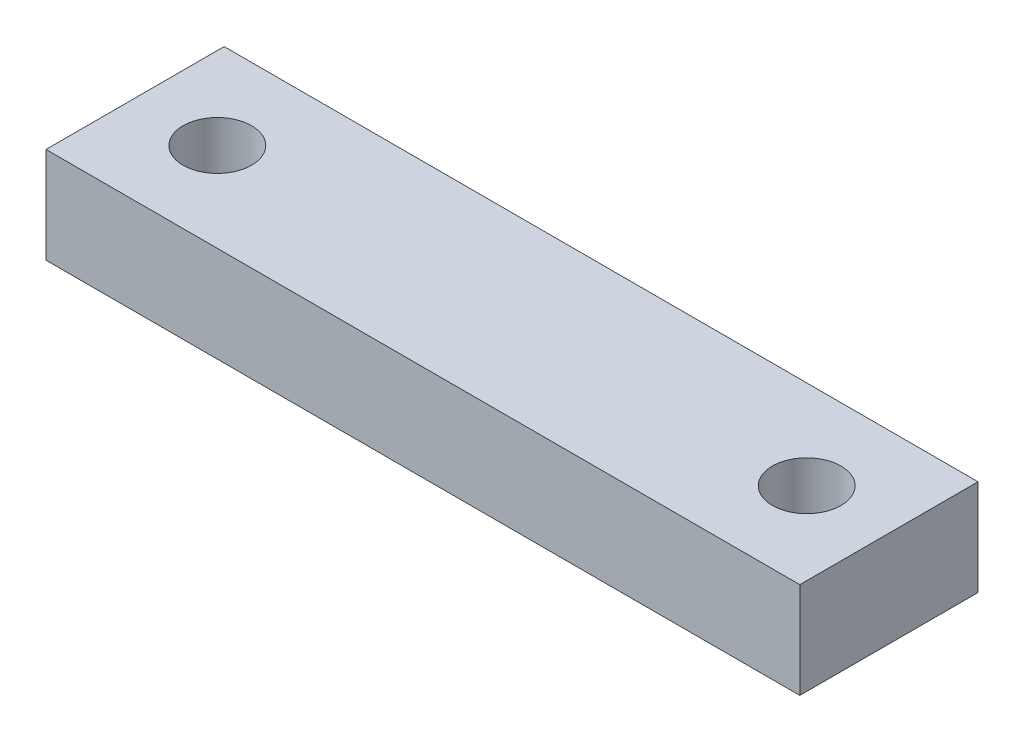
ISO-10303-21;
HEADER;
FILE_DESCRIPTION(('STEP AP214'),'2;1');
FILE_NAME('part.step','',(''),(''),'','','');
FILE_SCHEMA(('AUTOMOTIVE_DESIGN { 1 0 10303 214 1 1 1 1 }'));
ENDSEC;
DATA;
#1=APPLICATION_CONTEXT('core data for automotive mechanical design processes');
#2=APPLICATION_PROTOCOL_DEFINITION('international standard','automotive_design',2000,#1);
#3=PRODUCT_CONTEXT('',#1,'mechanical');
#4=PRODUCT('Part','Part','',(#3));
#5=PRODUCT_RELATED_PRODUCT_CATEGORY('part','',(#4));
#6=PRODUCT_DEFINITION_FORMATION('','',#4);
#7=PRODUCT_DEFINITION_CONTEXT('part definition',#1,'design');
#8=PRODUCT_DEFINITION('design','',#6,#7);
#9=PRODUCT_DEFINITION_SHAPE('','',#8);
#10=(LENGTH_UNIT() NAMED_UNIT(*) SI_UNIT(.MILLI.,.METRE.));
#11=(NAMED_UNIT(*) PLANE_ANGLE_UNIT() SI_UNIT($,.RADIAN.));
#12=(NAMED_UNIT(*) SI_UNIT($,.STERADIAN.) SOLID_ANGLE_UNIT());
#13=UNCERTAINTY_MEASURE_WITH_UNIT(LENGTH_MEASURE(1.E-05),#10,'distance_accuracy_value','');
#14=(GEOMETRIC_REPRESENTATION_CONTEXT(3) GLOBAL_UNCERTAINTY_ASSIGNED_CONTEXT((#13)) GLOBAL_UNIT_ASSIGNED_CONTEXT((#10,
#11,#12)) REPRESENTATION_CONTEXT('',''));
#15=CARTESIAN_POINT('',(0.,0.,0.));
#16=DIRECTION('',(0.,0.,1.));
#17=DIRECTION('',(1.,0.,0.));
#18=AXIS2_PLACEMENT_3D('',#15,#16,#17);
#19=CARTESIAN_POINT('',(27.5,7.,-6.5));
#20=DIRECTION('',(-1.,0.,0.));
#21=DIRECTION('',(0.,0.,1.));
#22=AXIS2_PLACEMENT_3D('',#19,#20,#21);
#23=PLANE('',#22);
#24=DIRECTION('',(0.,0.,-1.));
#25=VECTOR('',#24,1.);
#26=CARTESIAN_POINT('',(27.5,0.,-6.5));
#27=LINE('',#26,#25);
#28=CARTESIAN_POINT('',(27.5,0.,6.5));
#29=VERTEX_POINT('',#28);
#30=CARTESIAN_POINT('',(27.5,0.,-6.5));
#31=VERTEX_POINT('',#30);
#32=EDGE_CURVE('E107',#29,#31,#27,.T.);
#33=ORIENTED_EDGE('',*,*,#32,.T.);
#34=DIRECTION('',(0.,-1.,0.));
#35=VECTOR('',#34,1.);
#36=CARTESIAN_POINT('',(27.5,7.,-6.5));
#37=LINE('',#36,#35);
#38=CARTESIAN_POINT('',(27.5,7.,-6.5));
#39=VERTEX_POINT('',#38);
#40=EDGE_CURVE('E11',#39,#31,#37,.T.);
#41=ORIENTED_EDGE('',*,*,#40,.F.);
#42=DIRECTION('',(0.,0.,-1.));
#43=VECTOR('',#42,1.);
#44=CARTESIAN_POINT('',(27.5,7.,-6.5));
#45=LINE('',#44,#43);
#46=CARTESIAN_POINT('',(27.5,7.,6.5));
#47=VERTEX_POINT('',#46);
#48=EDGE_CURVE('E91',#47,#39,#45,.T.);
#49=ORIENTED_EDGE('',*,*,#48,.F.);
#50=DIRECTION('',(0.,-1.,0.));
#51=VECTOR('',#50,1.);
#52=CARTESIAN_POINT('',(27.5,7.,6.5));
#53=LINE('',#52,#51);
#54=EDGE_CURVE('E103',#47,#29,#53,.T.);
#55=ORIENTED_EDGE('',*,*,#54,.T.);
#56=EDGE_LOOP('',(#33,#41,#49,#55));
#57=FACE_BOUND('',#56,.T.);
#58=ADVANCED_FACE('F39',(#57),#23,.F.);
#59=CARTESIAN_POINT('',(-27.5,7.,-6.5));
#60=DIRECTION('',(0.,0.,1.));
#61=DIRECTION('',(1.,0.,0.));
#62=AXIS2_PLACEMENT_3D('',#59,#60,#61);
#63=PLANE('',#62);
#64=DIRECTION('',(-1.,0.,0.));
#65=VECTOR('',#64,1.);
#66=CARTESIAN_POINT('',(-27.5,0.,-6.5));
#67=LINE('',#66,#65);
#68=CARTESIAN_POINT('',(-27.5,0.,-6.5));
#69=VERTEX_POINT('',#68);
#70=EDGE_CURVE('E96',#31,#69,#67,.T.);
#71=ORIENTED_EDGE('',*,*,#70,.T.);
#72=DIRECTION('',(0.,-1.,0.));
#73=VECTOR('',#72,1.);
#74=CARTESIAN_POINT('',(-27.5,7.,-6.5));
#75=LINE('',#74,#73);
#76=CARTESIAN_POINT('',(-27.5,7.,-6.5));
#77=VERTEX_POINT('',#76);
#78=EDGE_CURVE('E48',#77,#69,#75,.T.);
#79=ORIENTED_EDGE('',*,*,#78,.F.);
#80=DIRECTION('',(-1.,0.,0.));
#81=VECTOR('',#80,1.);
#82=CARTESIAN_POINT('',(-27.5,7.,-6.5));
#83=LINE('',#82,#81);
#84=EDGE_CURVE('E86',#39,#77,#83,.T.);
#85=ORIENTED_EDGE('',*,*,#84,.F.);
#86=ORIENTED_EDGE('',*,*,#40,.T.);
#87=EDGE_LOOP('',(#71,#79,#85,#86));
#88=FACE_BOUND('',#87,.T.);
#89=ADVANCED_FACE('F95',(#88),#63,.F.);
#90=CARTESIAN_POINT('',(-27.5,7.,-6.5));
#91=DIRECTION('',(1.,0.,0.));
#92=DIRECTION('',(0.,0.,-1.));
#93=AXIS2_PLACEMENT_3D('',#90,#91,#92);
#94=PLANE('',#93);
#95=DIRECTION('',(0.,0.,1.));
#96=VECTOR('',#95,1.);
#97=CARTESIAN_POINT('',(-27.5,0.,-6.5));
#98=LINE('',#97,#96);
#99=CARTESIAN_POINT('',(-27.5,0.,6.5));
#100=VERTEX_POINT('',#99);
#101=EDGE_CURVE('E73',#69,#100,#98,.T.);
#102=ORIENTED_EDGE('',*,*,#101,.T.);
#103=DIRECTION('',(0.,-1.,0.));
#104=VECTOR('',#103,1.);
#105=CARTESIAN_POINT('',(-27.5,7.,6.5));
#106=LINE('',#105,#104);
#107=CARTESIAN_POINT('',(-27.5,7.,6.5));
#108=VERTEX_POINT('',#107);
#109=EDGE_CURVE('E98',#108,#100,#106,.T.);
#110=ORIENTED_EDGE('',*,*,#109,.F.);
#111=DIRECTION('',(0.,0.,1.));
#112=VECTOR('',#111,1.);
#113=CARTESIAN_POINT('',(-27.5,7.,-6.5));
#114=LINE('',#113,#112);
#115=EDGE_CURVE('E89',#77,#108,#114,.T.);
#116=ORIENTED_EDGE('',*,*,#115,.F.);
#117=ORIENTED_EDGE('',*,*,#78,.T.);
#118=EDGE_LOOP('',(#102,#110,#116,#117));
#119=FACE_BOUND('',#118,.T.);
#120=ADVANCED_FACE('F99',(#119),#94,.F.);
#121=CARTESIAN_POINT('',(-27.5,7.,6.5));
#122=DIRECTION('',(0.,0.,-1.));
#123=DIRECTION('',(-1.,0.,0.));
#124=AXIS2_PLACEMENT_3D('',#121,#122,#123);
#125=PLANE('',#124);
#126=DIRECTION('',(1.,0.,0.));
#127=VECTOR('',#126,1.);
#128=CARTESIAN_POINT('',(-27.5,0.,6.5));
#129=LINE('',#128,#127);
#130=EDGE_CURVE('E79',#100,#29,#129,.T.);
#131=ORIENTED_EDGE('',*,*,#130,.T.);
#132=ORIENTED_EDGE('',*,*,#54,.F.);
#133=DIRECTION('',(1.,0.,0.));
#134=VECTOR('',#133,1.);
#135=CARTESIAN_POINT('',(-27.5,7.,6.5));
#136=LINE('',#135,#134);
#137=EDGE_CURVE('E56',#108,#47,#136,.T.);
#138=ORIENTED_EDGE('',*,*,#137,.F.);
#139=ORIENTED_EDGE('',*,*,#109,.T.);
#140=EDGE_LOOP('',(#131,#132,#138,#139));
#141=FACE_BOUND('',#140,.T.);
#142=ADVANCED_FACE('F121',(#141),#125,.F.);
#143=CARTESIAN_POINT('',(0.,7.,0.));
#144=DIRECTION('',(0.,1.,0.));
#145=DIRECTION('',(0.,0.,1.));
#146=AXIS2_PLACEMENT_3D('',#143,#144,#145);
#147=PLANE('',#146);
#148=CARTESIAN_POINT('',(-21.5,7.,0.));
#149=DIRECTION('',(0.,1.,0.));
#150=DIRECTION('',(0.,0.,1.));
#151=AXIS2_PLACEMENT_3D('',#148,#149,#150);
#152=CIRCLE('',#151,2.5);
#153=CARTESIAN_POINT('',(-21.5,7.,2.5));
#154=VERTEX_POINT('',#153);
#155=EDGE_CURVE('E136',#154,#154,#152,.T.);
#156=ORIENTED_EDGE('',*,*,#155,.F.);
#157=EDGE_LOOP('',(#156));
#158=FACE_BOUND('',#157,.T.);
#159=CARTESIAN_POINT('',(21.5,7.,0.));
#160=DIRECTION('',(0.,1.,0.));
#161=DIRECTION('',(0.,0.,-1.));
#162=AXIS2_PLACEMENT_3D('',#159,#160,#161);
#163=CIRCLE('',#162,2.5);
#164=CARTESIAN_POINT('',(21.5,7.,2.5));
#165=VERTEX_POINT('',#164);
#166=EDGE_CURVE('E128',#165,#165,#163,.T.);
#167=ORIENTED_EDGE('',*,*,#166,.F.);
#168=EDGE_LOOP('',(#167));
#169=FACE_BOUND('',#168,.T.);
#170=ORIENTED_EDGE('',*,*,#48,.T.);
#171=ORIENTED_EDGE('',*,*,#84,.T.);
#172=ORIENTED_EDGE('',*,*,#115,.T.);
#173=ORIENTED_EDGE('',*,*,#137,.T.);
#174=EDGE_LOOP('',(#170,#171,#172,#173));
#175=FACE_BOUND('',#174,.T.);
#176=ADVANCED_FACE('F87',(#158,#169,#175),#147,.T.);
#177=CARTESIAN_POINT('',(0.,0.,0.));
#178=DIRECTION('',(0.,1.,0.));
#179=DIRECTION('',(0.,0.,1.));
#180=AXIS2_PLACEMENT_3D('',#177,#178,#179);
#181=PLANE('',#180);
#182=CARTESIAN_POINT('',(-21.5,0.,0.));
#183=DIRECTION('',(0.,1.,0.));
#184=DIRECTION('',(0.,0.,1.));
#185=AXIS2_PLACEMENT_3D('',#182,#183,#184);
#186=CIRCLE('',#185,2.5);
#187=CARTESIAN_POINT('',(-21.5,0.,2.5));
#188=VERTEX_POINT('',#187);
#189=EDGE_CURVE('E111',#188,#188,#186,.T.);
#190=ORIENTED_EDGE('',*,*,#189,.T.);
#191=EDGE_LOOP('',(#190));
#192=FACE_BOUND('',#191,.T.);
#193=CARTESIAN_POINT('',(21.5,0.,0.));
#194=DIRECTION('',(0.,1.,0.));
#195=DIRECTION('',(0.,0.,-1.));
#196=AXIS2_PLACEMENT_3D('',#193,#194,#195);
#197=CIRCLE('',#196,2.5);
#198=CARTESIAN_POINT('',(21.5,0.,2.5));
#199=VERTEX_POINT('',#198);
#200=EDGE_CURVE('E132',#199,#199,#197,.T.);
#201=ORIENTED_EDGE('',*,*,#200,.T.);
#202=EDGE_LOOP('',(#201));
#203=FACE_BOUND('',#202,.T.);
#204=ORIENTED_EDGE('',*,*,#32,.F.);
#205=ORIENTED_EDGE('',*,*,#130,.F.);
#206=ORIENTED_EDGE('',*,*,#101,.F.);
#207=ORIENTED_EDGE('',*,*,#70,.F.);
#208=EDGE_LOOP('',(#204,#205,#206,#207));
#209=FACE_BOUND('',#208,.T.);
#210=ADVANCED_FACE('F124',(#192,#203,#209),#181,.F.);
#211=CARTESIAN_POINT('',(21.5,0.,0.));
#212=DIRECTION('',(0.,1.,0.));
#213=DIRECTION('',(0.,0.,1.));
#214=AXIS2_PLACEMENT_3D('',#211,#212,#213);
#215=CYLINDRICAL_SURFACE('',#214,2.5);
#216=CARTESIAN_POINT('',(21.5,0.,2.5));
#217=CARTESIAN_POINT('',(21.5,0.0729166666666667,2.5));
#218=CARTESIAN_POINT('',(21.5,0.145833333333333,2.5));
#219=CARTESIAN_POINT('',(21.5,0.291666666666667,2.5));
#220=CARTESIAN_POINT('',(21.5,0.364583333333333,2.5));
#221=CARTESIAN_POINT('',(21.5,0.510416666666667,2.5));
#222=CARTESIAN_POINT('',(21.5,0.583333333333333,2.5));
#223=CARTESIAN_POINT('',(21.5,0.729166666666667,2.5));
#224=CARTESIAN_POINT('',(21.5,0.802083333333333,2.5));
#225=CARTESIAN_POINT('',(21.5,0.947916666666666,2.5));
#226=CARTESIAN_POINT('',(21.5,1.02083333333333,2.5));
#227=CARTESIAN_POINT('',(21.5,1.16666666666667,2.5));
#228=CARTESIAN_POINT('',(21.5,1.23958333333333,2.5));
#229=CARTESIAN_POINT('',(21.5,1.38541666666667,2.5));
#230=CARTESIAN_POINT('',(21.5,1.45833333333333,2.5));
#231=CARTESIAN_POINT('',(21.5,1.60416666666667,2.5));
#232=CARTESIAN_POINT('',(21.5,1.67708333333333,2.5));
#233=CARTESIAN_POINT('',(21.5,1.82291666666667,2.5));
#234=CARTESIAN_POINT('',(21.5,1.89583333333333,2.5));
#235=CARTESIAN_POINT('',(21.5,2.04166666666667,2.5));
#236=CARTESIAN_POINT('',(21.5,2.11458333333333,2.5));
#237=CARTESIAN_POINT('',(21.5,2.26041666666667,2.5));
#238=CARTESIAN_POINT('',(21.5,2.33333333333333,2.5));
#239=CARTESIAN_POINT('',(21.5,2.47916666666667,2.5));
#240=CARTESIAN_POINT('',(21.5,2.55208333333333,2.5));
#241=CARTESIAN_POINT('',(21.5,2.69791666666667,2.5));
#242=CARTESIAN_POINT('',(21.5,2.77083333333333,2.5));
#243=CARTESIAN_POINT('',(21.5,2.91666666666667,2.5));
#244=CARTESIAN_POINT('',(21.5,2.98958333333333,2.5));
#245=CARTESIAN_POINT('',(21.5,3.13541666666667,2.5));
#246=CARTESIAN_POINT('',(21.5,3.20833333333333,2.5));
#247=CARTESIAN_POINT('',(21.5,3.35416666666667,2.5));
#248=CARTESIAN_POINT('',(21.5,3.42708333333333,2.5));
#249=CARTESIAN_POINT('',(21.5,3.57291666666667,2.5));
#250=CARTESIAN_POINT('',(21.5,3.64583333333333,2.5));
#251=CARTESIAN_POINT('',(21.5,3.79166666666667,2.5));
#252=CARTESIAN_POINT('',(21.5,3.86458333333333,2.5));
#253=CARTESIAN_POINT('',(21.5,4.01041666666667,2.5));
#254=CARTESIAN_POINT('',(21.5,4.08333333333333,2.5));
#255=CARTESIAN_POINT('',(21.5,4.22916666666667,2.5));
#256=CARTESIAN_POINT('',(21.5,4.30208333333333,2.5));
#257=CARTESIAN_POINT('',(21.5,4.44791666666667,2.5));
#258=CARTESIAN_POINT('',(21.5,4.52083333333333,2.5));
#259=CARTESIAN_POINT('',(21.5,4.66666666666667,2.5));
#260=CARTESIAN_POINT('',(21.5,4.73958333333333,2.5));
#261=CARTESIAN_POINT('',(21.5,4.88541666666666,2.5));
#262=CARTESIAN_POINT('',(21.5,4.95833333333333,2.5));
#263=CARTESIAN_POINT('',(21.5,5.10416666666667,2.5));
#264=CARTESIAN_POINT('',(21.5,5.17708333333333,2.5));
#265=CARTESIAN_POINT('',(21.5,5.32291666666667,2.5));
#266=CARTESIAN_POINT('',(21.5,5.39583333333333,2.5));
#267=CARTESIAN_POINT('',(21.5,5.54166666666667,2.5));
#268=CARTESIAN_POINT('',(21.5,5.61458333333333,2.5));
#269=CARTESIAN_POINT('',(21.5,5.76041666666667,2.5));
#270=CARTESIAN_POINT('',(21.5,5.83333333333333,2.5));
#271=CARTESIAN_POINT('',(21.5,5.97916666666667,2.5));
#272=CARTESIAN_POINT('',(21.5,6.05208333333333,2.5));
#273=CARTESIAN_POINT('',(21.5,6.19791666666667,2.5));
#274=CARTESIAN_POINT('',(21.5,6.27083333333333,2.5));
#275=CARTESIAN_POINT('',(21.5,6.41666666666667,2.5));
#276=CARTESIAN_POINT('',(21.5,6.48958333333333,2.5));
#277=CARTESIAN_POINT('',(21.5,6.63541666666666,2.5));
#278=CARTESIAN_POINT('',(21.5,6.70833333333333,2.5));
#279=CARTESIAN_POINT('',(21.5,6.85416666666666,2.5));
#280=CARTESIAN_POINT('',(21.5,6.92708333333333,2.5));
#281=CARTESIAN_POINT('',(21.5,7.,2.5));
#282=B_SPLINE_CURVE_WITH_KNOTS('',3,(#216,#217,#218,#219,#220,#221,#222,#223,#224,#225,#226,
#227,#228,#229,#230,#231,#232,#233,#234,#235,#236,#237,#238,#239,#240,#241,#242,#243,#244,#245,
#246,#247,#248,#249,#250,#251,#252,#253,#254,#255,#256,#257,#258,#259,#260,#261,#262,#263,#264,
#265,#266,#267,#268,#269,#270,#271,#272,#273,#274,#275,#276,#277,#278,#279,#280,#281),
.UNSPECIFIED.,.F.,.F.,(4,2,2,2,2,2,2,2,2,2,2,2,2,2,2,2,2,2,2,2,2,2,2,2,2,2,2,2,2,2,2,2,4),(0.,
0.21875,0.4375,0.65625,0.875,1.09375,1.3125,1.53125,1.75,1.96875,2.1875,2.40625,2.625,2.84375,
3.0625,3.28125,3.5,3.71875,3.9375,4.15625,4.375,4.59375,4.8125,5.03125,5.25,5.46875,5.6875,
5.90625,6.125,6.34375,6.5625,6.78125,7.),.UNSPECIFIED.);
#283=EDGE_CURVE('BSEAM149',#199,#165,#282,.T.);
#284=ORIENTED_EDGE('',*,*,#200,.F.);
#285=ORIENTED_EDGE('',*,*,#166,.T.);
#286=ORIENTED_EDGE('',*,*,#283,.T.);
#287=ORIENTED_EDGE('',*,*,#283,.F.);
#288=EDGE_LOOP('',(#284,#286,#285,#287));
#289=FACE_BOUND('',#288,.T.);
#290=ADVANCED_FACE('F149',(#289),#215,.F.);
#291=CARTESIAN_POINT('',(-21.5,0.,0.));
#292=DIRECTION('',(0.,1.,0.));
#293=DIRECTION('',(0.,0.,1.));
#294=AXIS2_PLACEMENT_3D('',#291,#292,#293);
#295=CYLINDRICAL_SURFACE('',#294,2.5);
#296=CARTESIAN_POINT('',(-21.5,0.,2.5));
#297=CARTESIAN_POINT('',(-21.5,0.0729166666666667,2.5));
#298=CARTESIAN_POINT('',(-21.5,0.145833333333333,2.5));
#299=CARTESIAN_POINT('',(-21.5,0.291666666666667,2.5));
#300=CARTESIAN_POINT('',(-21.5,0.364583333333333,2.5));
#301=CARTESIAN_POINT('',(-21.5,0.510416666666667,2.5));
#302=CARTESIAN_POINT('',(-21.5,0.583333333333333,2.5));
#303=CARTESIAN_POINT('',(-21.5,0.729166666666667,2.5));
#304=CARTESIAN_POINT('',(-21.5,0.802083333333333,2.5));
#305=CARTESIAN_POINT('',(-21.5,0.947916666666666,2.5));
#306=CARTESIAN_POINT('',(-21.5,1.02083333333333,2.5));
#307=CARTESIAN_POINT('',(-21.5,1.16666666666667,2.5));
#308=CARTESIAN_POINT('',(-21.5,1.23958333333333,2.5));
#309=CARTESIAN_POINT('',(-21.5,1.38541666666667,2.5));
#310=CARTESIAN_POINT('',(-21.5,1.45833333333333,2.5));
#311=CARTESIAN_POINT('',(-21.5,1.60416666666667,2.5));
#312=CARTESIAN_POINT('',(-21.5,1.67708333333333,2.5));
#313=CARTESIAN_POINT('',(-21.5,1.82291666666667,2.5));
#314=CARTESIAN_POINT('',(-21.5,1.89583333333333,2.5));
#315=CARTESIAN_POINT('',(-21.5,2.04166666666667,2.5));
#316=CARTESIAN_POINT('',(-21.5,2.11458333333333,2.5));
#317=CARTESIAN_POINT('',(-21.5,2.26041666666667,2.5));
#318=CARTESIAN_POINT('',(-21.5,2.33333333333333,2.5));
#319=CARTESIAN_POINT('',(-21.5,2.47916666666667,2.5));
#320=CARTESIAN_POINT('',(-21.5,2.55208333333333,2.5));
#321=CARTESIAN_POINT('',(-21.5,2.69791666666667,2.5));
#322=CARTESIAN_POINT('',(-21.5,2.77083333333333,2.5));
#323=CARTESIAN_POINT('',(-21.5,2.91666666666667,2.5));
#324=CARTESIAN_POINT('',(-21.5,2.98958333333333,2.5));
#325=CARTESIAN_POINT('',(-21.5,3.13541666666667,2.5));
#326=CARTESIAN_POINT('',(-21.5,3.20833333333333,2.5));
#327=CARTESIAN_POINT('',(-21.5,3.35416666666667,2.5));
#328=CARTESIAN_POINT('',(-21.5,3.42708333333333,2.5));
#329=CARTESIAN_POINT('',(-21.5,3.57291666666667,2.5));
#330=CARTESIAN_POINT('',(-21.5,3.64583333333333,2.5));
#331=CARTESIAN_POINT('',(-21.5,3.79166666666667,2.5));
#332=CARTESIAN_POINT('',(-21.5,3.86458333333333,2.5));
#333=CARTESIAN_POINT('',(-21.5,4.01041666666667,2.5));
#334=CARTESIAN_POINT('',(-21.5,4.08333333333333,2.5));
#335=CARTESIAN_POINT('',(-21.5,4.22916666666667,2.5));
#336=CARTESIAN_POINT('',(-21.5,4.30208333333333,2.5));
#337=CARTESIAN_POINT('',(-21.5,4.44791666666667,2.5));
#338=CARTESIAN_POINT('',(-21.5,4.52083333333333,2.5));
#339=CARTESIAN_POINT('',(-21.5,4.66666666666667,2.5));
#340=CARTESIAN_POINT('',(-21.5,4.73958333333333,2.5));
#341=CARTESIAN_POINT('',(-21.5,4.88541666666666,2.5));
#342=CARTESIAN_POINT('',(-21.5,4.95833333333333,2.5));
#343=CARTESIAN_POINT('',(-21.5,5.10416666666667,2.5));
#344=CARTESIAN_POINT('',(-21.5,5.17708333333333,2.5));
#345=CARTESIAN_POINT('',(-21.5,5.32291666666667,2.5));
#346=CARTESIAN_POINT('',(-21.5,5.39583333333333,2.5));
#347=CARTESIAN_POINT('',(-21.5,5.54166666666667,2.5));
#348=CARTESIAN_POINT('',(-21.5,5.61458333333333,2.5));
#349=CARTESIAN_POINT('',(-21.5,5.76041666666667,2.5));
#350=CARTESIAN_POINT('',(-21.5,5.83333333333333,2.5));
#351=CARTESIAN_POINT('',(-21.5,5.97916666666667,2.5));
#352=CARTESIAN_POINT('',(-21.5,6.05208333333333,2.5));
#353=CARTESIAN_POINT('',(-21.5,6.19791666666667,2.5));
#354=CARTESIAN_POINT('',(-21.5,6.27083333333333,2.5));
#355=CARTESIAN_POINT('',(-21.5,6.41666666666667,2.5));
#356=CARTESIAN_POINT('',(-21.5,6.48958333333333,2.5));
#357=CARTESIAN_POINT('',(-21.5,6.63541666666666,2.5));
#358=CARTESIAN_POINT('',(-21.5,6.70833333333333,2.5));
#359=CARTESIAN_POINT('',(-21.5,6.85416666666666,2.5));
#360=CARTESIAN_POINT('',(-21.5,6.92708333333333,2.5));
#361=CARTESIAN_POINT('',(-21.5,7.,2.5));
#362=B_SPLINE_CURVE_WITH_KNOTS('',3,(#296,#297,#298,#299,#300,#301,#302,#303,#304,#305,#306,
#307,#308,#309,#310,#311,#312,#313,#314,#315,#316,#317,#318,#319,#320,#321,#322,#323,#324,#325,
#326,#327,#328,#329,#330,#331,#332,#333,#334,#335,#336,#337,#338,#339,#340,#341,#342,#343,#344,
#345,#346,#347,#348,#349,#350,#351,#352,#353,#354,#355,#356,#357,#358,#359,#360,#361),
.UNSPECIFIED.,.F.,.F.,(4,2,2,2,2,2,2,2,2,2,2,2,2,2,2,2,2,2,2,2,2,2,2,2,2,2,2,2,2,2,2,2,4),(0.,
0.21875,0.4375,0.65625,0.875,1.09375,1.3125,1.53125,1.75,1.96875,2.1875,2.40625,2.625,2.84375,
3.0625,3.28125,3.5,3.71875,3.9375,4.15625,4.375,4.59375,4.8125,5.03125,5.25,5.46875,5.6875,
5.90625,6.125,6.34375,6.5625,6.78125,7.),.UNSPECIFIED.);
#363=EDGE_CURVE('BSEAM146',#188,#154,#362,.T.);
#364=ORIENTED_EDGE('',*,*,#189,.F.);
#365=ORIENTED_EDGE('',*,*,#155,.T.);
#366=ORIENTED_EDGE('',*,*,#363,.T.);
#367=ORIENTED_EDGE('',*,*,#363,.F.);
#368=EDGE_LOOP('',(#364,#366,#365,#367));
#369=FACE_BOUND('',#368,.T.);
#370=ADVANCED_FACE('F146',(#369),#295,.F.);
#371=CLOSED_SHELL('',(#58,#89,#120,#142,#176,#210,#290,#370));
#372=MANIFOLD_SOLID_BREP('B2',#371);
#373=ADVANCED_BREP_SHAPE_REPRESENTATION('',(#18,#372),#14);
#374=SHAPE_DEFINITION_REPRESENTATION(#9,#373);
ENDSEC;
END-ISO-10303-21;
